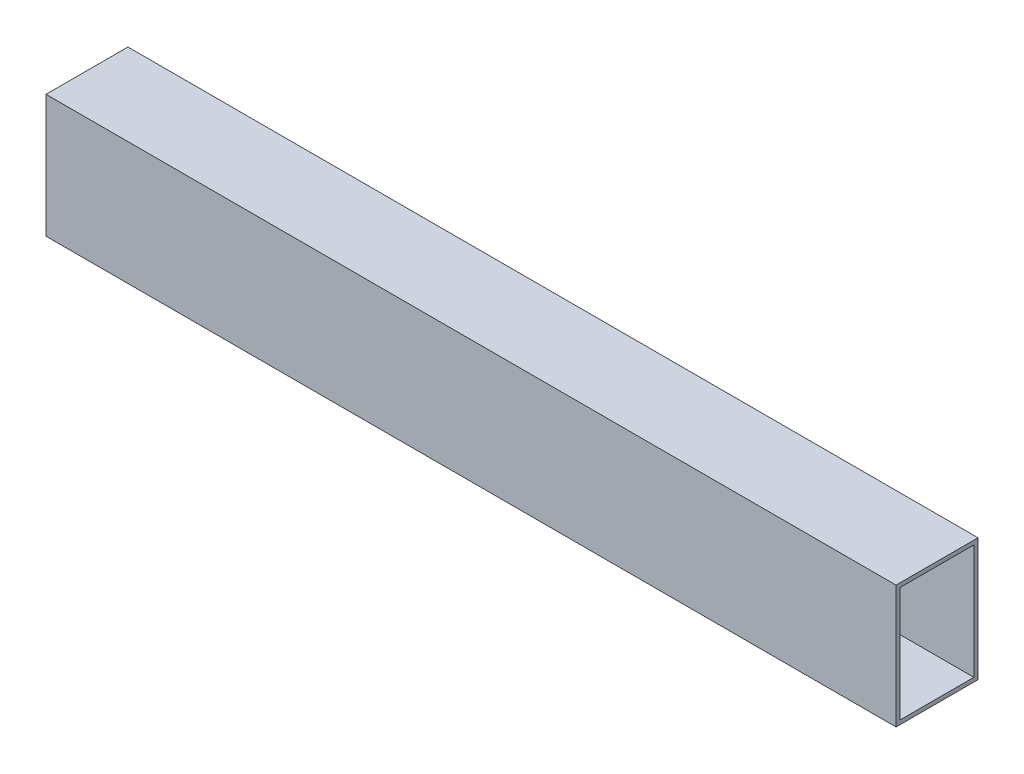
ISO-10303-21;
HEADER;
FILE_DESCRIPTION(('STEP AP214'),'2;1');
FILE_NAME('part.step','',(''),(''),'','','');
FILE_SCHEMA(('AUTOMOTIVE_DESIGN { 1 0 10303 214 1 1 1 1 }'));
ENDSEC;
DATA;
#1=APPLICATION_CONTEXT('core data for automotive mechanical design processes');
#2=APPLICATION_PROTOCOL_DEFINITION('international standard','automotive_design',2000,#1);
#3=PRODUCT_CONTEXT('',#1,'mechanical');
#4=PRODUCT('Part','Part','',(#3));
#5=PRODUCT_RELATED_PRODUCT_CATEGORY('part','',(#4));
#6=PRODUCT_DEFINITION_FORMATION('','',#4);
#7=PRODUCT_DEFINITION_CONTEXT('part definition',#1,'design');
#8=PRODUCT_DEFINITION('design','',#6,#7);
#9=PRODUCT_DEFINITION_SHAPE('','',#8);
#10=(LENGTH_UNIT() NAMED_UNIT(*) SI_UNIT(.MILLI.,.METRE.));
#11=(NAMED_UNIT(*) PLANE_ANGLE_UNIT() SI_UNIT($,.RADIAN.));
#12=(NAMED_UNIT(*) SI_UNIT($,.STERADIAN.) SOLID_ANGLE_UNIT());
#13=UNCERTAINTY_MEASURE_WITH_UNIT(LENGTH_MEASURE(1.E-05),#10,'distance_accuracy_value','');
#14=(GEOMETRIC_REPRESENTATION_CONTEXT(3) GLOBAL_UNCERTAINTY_ASSIGNED_CONTEXT((#13)) GLOBAL_UNIT_ASSIGNED_CONTEXT((#10,
#11,#12)) REPRESENTATION_CONTEXT('',''));
#15=CARTESIAN_POINT('',(0.,0.,0.));
#16=DIRECTION('',(0.,0.,1.));
#17=DIRECTION('',(1.,0.,0.));
#18=AXIS2_PLACEMENT_3D('',#15,#16,#17);
#19=CARTESIAN_POINT('',(1410.,2407.5,150.000000000003));
#20=DIRECTION('',(0.,1.,0.));
#21=DIRECTION('',(0.,0.,1.));
#22=AXIS2_PLACEMENT_3D('',#19,#20,#21);
#23=PLANE('',#22);
#24=DIRECTION('',(0.,0.,1.));
#25=VECTOR('',#24,1.);
#26=CARTESIAN_POINT('',(3240.,2407.5,150.000000000003));
#27=LINE('',#26,#25);
#28=CARTESIAN_POINT('',(3240.,2407.5,-49.999999999997));
#29=VERTEX_POINT('',#28);
#30=CARTESIAN_POINT('',(3240.,2407.5,150.000000000003));
#31=VERTEX_POINT('',#30);
#32=EDGE_CURVE('E11',#29,#31,#27,.T.);
#33=ORIENTED_EDGE('',*,*,#32,.F.);
#34=DIRECTION('',(-1.,0.,0.));
#35=VECTOR('',#34,1.);
#36=CARTESIAN_POINT('',(3600.5551275464,2407.5,-49.999999999997));
#37=LINE('',#36,#35);
#38=CARTESIAN_POINT('',(1165.,2407.5,-49.999999999997));
#39=VERTEX_POINT('',#38);
#40=EDGE_CURVE('E180',#29,#39,#37,.T.);
#41=ORIENTED_EDGE('',*,*,#40,.T.);
#42=DIRECTION('',(0.,0.,-1.));
#43=VECTOR('',#42,1.);
#44=CARTESIAN_POINT('',(1165.,2407.5,-49.999999999997));
#45=LINE('',#44,#43);
#46=CARTESIAN_POINT('',(1165.,2407.5,150.000000000003));
#47=VERTEX_POINT('',#46);
#48=EDGE_CURVE('E144',#47,#39,#45,.T.);
#49=ORIENTED_EDGE('',*,*,#48,.F.);
#50=DIRECTION('',(-1.,0.,0.));
#51=VECTOR('',#50,1.);
#52=CARTESIAN_POINT('',(3600.5551275464,2407.5,150.000000000003));
#53=LINE('',#52,#51);
#54=EDGE_CURVE('E56',#31,#47,#53,.T.);
#55=ORIENTED_EDGE('',*,*,#54,.F.);
#56=EDGE_LOOP('',(#33,#41,#49,#55));
#57=FACE_BOUND('',#56,.T.);
#58=ADVANCED_FACE('F39',(#57),#23,.T.);
#59=CARTESIAN_POINT('',(3600.5551275464,2397.5,0.));
#60=DIRECTION('',(0.,-1.,0.));
#61=DIRECTION('',(0.,0.,-1.));
#62=AXIS2_PLACEMENT_3D('',#59,#60,#61);
#63=PLANE('',#62);
#64=DIRECTION('',(-1.,0.,0.));
#65=VECTOR('',#64,1.);
#66=CARTESIAN_POINT('',(3600.5551275464,2397.5,140.000000000003));
#67=LINE('',#66,#65);
#68=CARTESIAN_POINT('',(3240.,2397.5,140.000000000003));
#69=VERTEX_POINT('',#68);
#70=CARTESIAN_POINT('',(1165.,2397.5,140.000000000003));
#71=VERTEX_POINT('',#70);
#72=EDGE_CURVE('E105',#69,#71,#67,.T.);
#73=ORIENTED_EDGE('',*,*,#72,.T.);
#74=DIRECTION('',(0.,0.,-1.));
#75=VECTOR('',#74,1.);
#76=CARTESIAN_POINT('',(1165.,2397.5,-39.999999999997));
#77=LINE('',#76,#75);
#78=CARTESIAN_POINT('',(1165.,2397.5,-39.999999999997));
#79=VERTEX_POINT('',#78);
#80=EDGE_CURVE('E110',#71,#79,#77,.T.);
#81=ORIENTED_EDGE('',*,*,#80,.T.);
#82=DIRECTION('',(-1.,0.,0.));
#83=VECTOR('',#82,1.);
#84=CARTESIAN_POINT('',(3600.5551275464,2397.5,-39.999999999997));
#85=LINE('',#84,#83);
#86=CARTESIAN_POINT('',(3240.,2397.5,-39.999999999997));
#87=VERTEX_POINT('',#86);
#88=EDGE_CURVE('E116',#87,#79,#85,.T.);
#89=ORIENTED_EDGE('',*,*,#88,.F.);
#90=DIRECTION('',(0.,0.,1.));
#91=VECTOR('',#90,1.);
#92=CARTESIAN_POINT('',(3240.,2397.5,0.));
#93=LINE('',#92,#91);
#94=EDGE_CURVE('E112',#87,#69,#93,.T.);
#95=ORIENTED_EDGE('',*,*,#94,.T.);
#96=EDGE_LOOP('',(#73,#81,#89,#95));
#97=FACE_BOUND('',#96,.T.);
#98=ADVANCED_FACE('F107',(#97),#63,.T.);
#99=CARTESIAN_POINT('',(3600.5551275464,0.,140.000000000003));
#100=DIRECTION('',(0.,0.,-1.));
#101=DIRECTION('',(-1.,0.,0.));
#102=AXIS2_PLACEMENT_3D('',#99,#100,#101);
#103=PLANE('',#102);
#104=DIRECTION('',(-1.,0.,0.));
#105=VECTOR('',#104,1.);
#106=CARTESIAN_POINT('',(3600.5551275464,2117.5,140.000000000003));
#107=LINE('',#106,#105);
#108=CARTESIAN_POINT('',(3240.,2117.5,140.000000000003));
#109=VERTEX_POINT('',#108);
#110=CARTESIAN_POINT('',(1165.,2117.5,140.000000000003));
#111=VERTEX_POINT('',#110);
#112=EDGE_CURVE('E123',#109,#111,#107,.T.);
#113=ORIENTED_EDGE('',*,*,#112,.T.);
#114=DIRECTION('',(0.,1.,0.));
#115=VECTOR('',#114,1.);
#116=CARTESIAN_POINT('',(1165.,2397.5,140.000000000003));
#117=LINE('',#116,#115);
#118=EDGE_CURVE('E120',#111,#71,#117,.T.);
#119=ORIENTED_EDGE('',*,*,#118,.T.);
#120=ORIENTED_EDGE('',*,*,#72,.F.);
#121=DIRECTION('',(0.,-1.,0.));
#122=VECTOR('',#121,1.);
#123=CARTESIAN_POINT('',(3240.,0.,140.000000000003));
#124=LINE('',#123,#122);
#125=EDGE_CURVE('E117',#69,#109,#124,.T.);
#126=ORIENTED_EDGE('',*,*,#125,.T.);
#127=EDGE_LOOP('',(#113,#119,#120,#126));
#128=FACE_BOUND('',#127,.T.);
#129=ADVANCED_FACE('F121',(#128),#103,.T.);
#130=CARTESIAN_POINT('',(3600.5551275464,2117.5,0.));
#131=DIRECTION('',(0.,1.,0.));
#132=DIRECTION('',(0.,0.,1.));
#133=AXIS2_PLACEMENT_3D('',#130,#131,#132);
#134=PLANE('',#133);
#135=DIRECTION('',(-1.,0.,0.));
#136=VECTOR('',#135,1.);
#137=CARTESIAN_POINT('',(3600.5551275464,2117.5,-39.999999999997));
#138=LINE('',#137,#136);
#139=CARTESIAN_POINT('',(3240.,2117.5,-39.999999999997));
#140=VERTEX_POINT('',#139);
#141=CARTESIAN_POINT('',(1165.,2117.5,-39.999999999997));
#142=VERTEX_POINT('',#141);
#143=EDGE_CURVE('E173',#140,#142,#138,.T.);
#144=ORIENTED_EDGE('',*,*,#143,.T.);
#145=DIRECTION('',(0.,0.,1.));
#146=VECTOR('',#145,1.);
#147=CARTESIAN_POINT('',(1165.,2117.5,140.000000000003));
#148=LINE('',#147,#146);
#149=EDGE_CURVE('E135',#142,#111,#148,.T.);
#150=ORIENTED_EDGE('',*,*,#149,.T.);
#151=ORIENTED_EDGE('',*,*,#112,.F.);
#152=DIRECTION('',(0.,0.,-1.));
#153=VECTOR('',#152,1.);
#154=CARTESIAN_POINT('',(3240.,2117.5,0.));
#155=LINE('',#154,#153);
#156=EDGE_CURVE('E166',#109,#140,#155,.T.);
#157=ORIENTED_EDGE('',*,*,#156,.T.);
#158=EDGE_LOOP('',(#144,#150,#151,#157));
#159=FACE_BOUND('',#158,.T.);
#160=ADVANCED_FACE('F230',(#159),#134,.T.);
#161=CARTESIAN_POINT('',(3600.5551275464,0.,-39.9999999999974));
#162=DIRECTION('',(0.,0.,1.));
#163=DIRECTION('',(0.,-1.,0.));
#164=AXIS2_PLACEMENT_3D('',#161,#162,#163);
#165=PLANE('',#164);
#166=ORIENTED_EDGE('',*,*,#88,.T.);
#167=DIRECTION('',(0.,-1.,0.));
#168=VECTOR('',#167,1.);
#169=CARTESIAN_POINT('',(1165.,2117.5,-39.999999999997));
#170=LINE('',#169,#168);
#171=EDGE_CURVE('E131',#79,#142,#170,.T.);
#172=ORIENTED_EDGE('',*,*,#171,.T.);
#173=ORIENTED_EDGE('',*,*,#143,.F.);
#174=DIRECTION('',(0.,1.,0.));
#175=VECTOR('',#174,1.);
#176=CARTESIAN_POINT('',(3240.,0.,-39.9999999999974));
#177=LINE('',#176,#175);
#178=EDGE_CURVE('E156',#140,#87,#177,.T.);
#179=ORIENTED_EDGE('',*,*,#178,.T.);
#180=EDGE_LOOP('',(#166,#172,#173,#179));
#181=FACE_BOUND('',#180,.T.);
#182=ADVANCED_FACE('F225',(#181),#165,.T.);
#183=CARTESIAN_POINT('',(1010.,2107.5,150.));
#184=DIRECTION('',(0.,1.,0.));
#185=DIRECTION('',(0.,0.,1.));
#186=AXIS2_PLACEMENT_3D('',#183,#184,#185);
#187=PLANE('',#186);
#188=DIRECTION('',(-1.,0.,0.));
#189=VECTOR('',#188,1.);
#190=CARTESIAN_POINT('',(3600.5551275464,2107.5,-49.999999999997));
#191=LINE('',#190,#189);
#192=CARTESIAN_POINT('',(3240.,2107.5,-49.999999999997));
#193=VERTEX_POINT('',#192);
#194=CARTESIAN_POINT('',(1165.,2107.5,-49.999999999997));
#195=VERTEX_POINT('',#194);
#196=EDGE_CURVE('E183',#193,#195,#191,.T.);
#197=ORIENTED_EDGE('',*,*,#196,.F.);
#198=DIRECTION('',(0.,0.,1.));
#199=VECTOR('',#198,1.);
#200=CARTESIAN_POINT('',(3240.,2107.5,150.));
#201=LINE('',#200,#199);
#202=CARTESIAN_POINT('',(3240.,2107.5,150.));
#203=VERTEX_POINT('',#202);
#204=EDGE_CURVE('E159',#193,#203,#201,.T.);
#205=ORIENTED_EDGE('',*,*,#204,.T.);
#206=DIRECTION('',(1.,0.,0.));
#207=VECTOR('',#206,1.);
#208=CARTESIAN_POINT('',(160.,2107.5,150.));
#209=LINE('',#208,#207);
#210=CARTESIAN_POINT('',(1165.,2107.5,150.));
#211=VERTEX_POINT('',#210);
#212=EDGE_CURVE('E188',#211,#203,#209,.T.);
#213=ORIENTED_EDGE('',*,*,#212,.F.);
#214=DIRECTION('',(0.,0.,1.));
#215=VECTOR('',#214,1.);
#216=CARTESIAN_POINT('',(1165.,2107.5,150.));
#217=LINE('',#216,#215);
#218=EDGE_CURVE('E152',#195,#211,#217,.T.);
#219=ORIENTED_EDGE('',*,*,#218,.F.);
#220=EDGE_LOOP('',(#197,#205,#213,#219));
#221=FACE_BOUND('',#220,.T.);
#222=ADVANCED_FACE('F200',(#221),#187,.F.);
#223=CARTESIAN_POINT('',(3240.,2107.5,-60.));
#224=DIRECTION('',(-1.,0.,0.));
#225=DIRECTION('',(0.,0.,1.));
#226=AXIS2_PLACEMENT_3D('',#223,#224,#225);
#227=PLANE('',#226);
#228=ORIENTED_EDGE('',*,*,#204,.F.);
#229=DIRECTION('',(0.,1.,0.));
#230=VECTOR('',#229,1.);
#231=CARTESIAN_POINT('',(3240.,2107.5,-49.999999999997));
#232=LINE('',#231,#230);
#233=EDGE_CURVE('E49',#193,#29,#232,.T.);
#234=ORIENTED_EDGE('',*,*,#233,.T.);
#235=ORIENTED_EDGE('',*,*,#32,.T.);
#236=DIRECTION('',(0.,1.,0.));
#237=VECTOR('',#236,1.);
#238=CARTESIAN_POINT('',(3240.,2347.5,150.));
#239=LINE('',#238,#237);
#240=EDGE_CURVE('E43',#203,#31,#239,.T.);
#241=ORIENTED_EDGE('',*,*,#240,.F.);
#242=EDGE_LOOP('',(#228,#234,#235,#241));
#243=FACE_BOUND('',#242,.T.);
#244=ORIENTED_EDGE('',*,*,#178,.F.);
#245=ORIENTED_EDGE('',*,*,#156,.F.);
#246=ORIENTED_EDGE('',*,*,#125,.F.);
#247=ORIENTED_EDGE('',*,*,#94,.F.);
#248=EDGE_LOOP('',(#244,#245,#246,#247));
#249=FACE_BOUND('',#248,.T.);
#250=ADVANCED_FACE('F196',(#243,#249),#227,.F.);
#251=CARTESIAN_POINT('',(3600.5551275464,2107.5,-49.999999999997));
#252=DIRECTION('',(0.,0.,1.));
#253=DIRECTION('',(0.,-1.,0.));
#254=AXIS2_PLACEMENT_3D('',#251,#252,#253);
#255=PLANE('',#254);
#256=ORIENTED_EDGE('',*,*,#40,.F.);
#257=ORIENTED_EDGE('',*,*,#233,.F.);
#258=ORIENTED_EDGE('',*,*,#196,.T.);
#259=DIRECTION('',(0.,-1.,0.));
#260=VECTOR('',#259,1.);
#261=CARTESIAN_POINT('',(1165.,2107.5,-49.999999999997));
#262=LINE('',#261,#260);
#263=EDGE_CURVE('E148',#39,#195,#262,.T.);
#264=ORIENTED_EDGE('',*,*,#263,.F.);
#265=EDGE_LOOP('',(#256,#257,#258,#264));
#266=FACE_BOUND('',#265,.T.);
#267=ADVANCED_FACE('F203',(#266),#255,.F.);
#268=CARTESIAN_POINT('',(160.,2347.5,150.));
#269=DIRECTION('',(0.,0.,-1.));
#270=DIRECTION('',(-1.,0.,0.));
#271=AXIS2_PLACEMENT_3D('',#268,#269,#270);
#272=PLANE('',#271);
#273=ORIENTED_EDGE('',*,*,#54,.T.);
#274=DIRECTION('',(0.,1.,0.));
#275=VECTOR('',#274,1.);
#276=CARTESIAN_POINT('',(1165.,2407.5,150.000000000003));
#277=LINE('',#276,#275);
#278=EDGE_CURVE('E140',#211,#47,#277,.T.);
#279=ORIENTED_EDGE('',*,*,#278,.F.);
#280=ORIENTED_EDGE('',*,*,#212,.T.);
#281=ORIENTED_EDGE('',*,*,#240,.T.);
#282=EDGE_LOOP('',(#273,#279,#280,#281));
#283=FACE_BOUND('',#282,.T.);
#284=ADVANCED_FACE('F41',(#283),#272,.F.);
#285=CARTESIAN_POINT('',(1165.,0.,0.));
#286=DIRECTION('',(1.,0.,0.));
#287=DIRECTION('',(0.,0.,-1.));
#288=AXIS2_PLACEMENT_3D('',#285,#286,#287);
#289=PLANE('',#288);
#290=ORIENTED_EDGE('',*,*,#278,.T.);
#291=ORIENTED_EDGE('',*,*,#48,.T.);
#292=ORIENTED_EDGE('',*,*,#263,.T.);
#293=ORIENTED_EDGE('',*,*,#218,.T.);
#294=EDGE_LOOP('',(#290,#291,#292,#293));
#295=FACE_BOUND('',#294,.T.);
#296=ORIENTED_EDGE('',*,*,#118,.F.);
#297=ORIENTED_EDGE('',*,*,#149,.F.);
#298=ORIENTED_EDGE('',*,*,#171,.F.);
#299=ORIENTED_EDGE('',*,*,#80,.F.);
#300=EDGE_LOOP('',(#296,#297,#298,#299));
#301=FACE_BOUND('',#300,.T.);
#302=ADVANCED_FACE('F129',(#295,#301),#289,.F.);
#303=CLOSED_SHELL('',(#58,#98,#129,#160,#182,#222,#250,#267,#284,#302));
#304=MANIFOLD_SOLID_BREP('B2',#303);
#305=ADVANCED_BREP_SHAPE_REPRESENTATION('',(#18,#304),#14);
#306=SHAPE_DEFINITION_REPRESENTATION(#9,#305);
ENDSEC;
END-ISO-10303-21;
